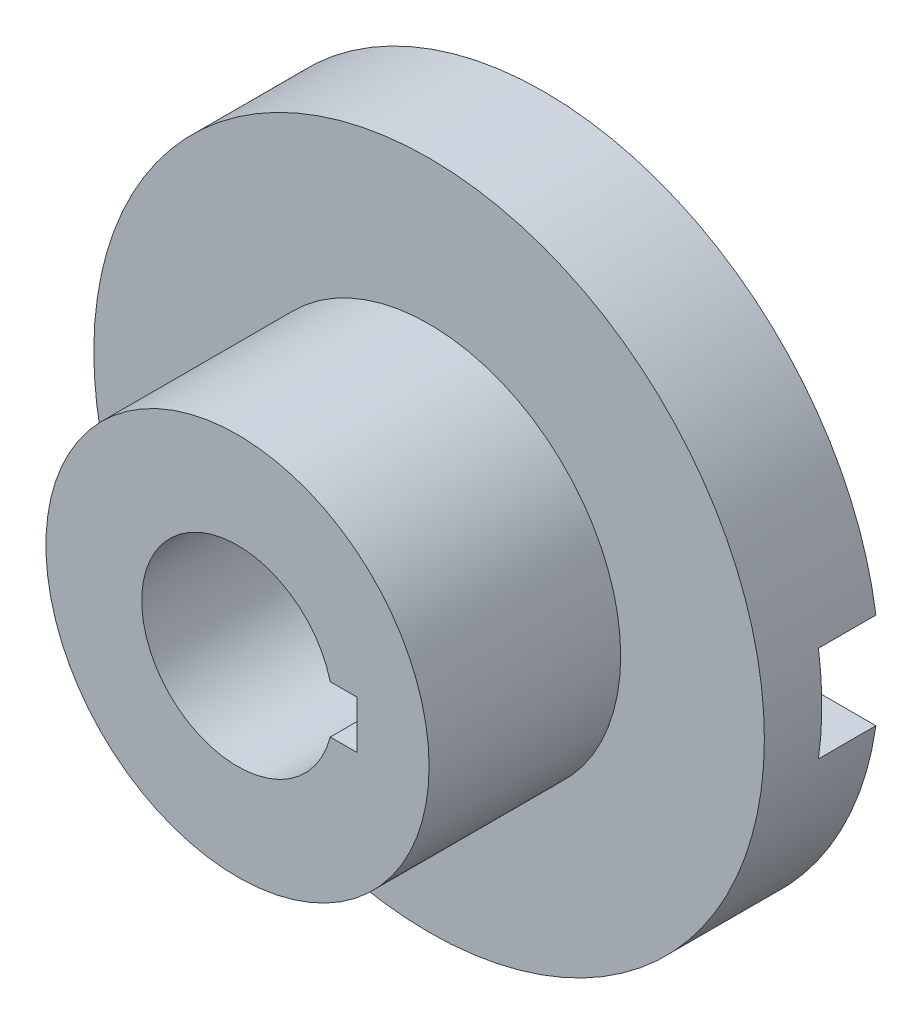
ISO-10303-21;
HEADER;
FILE_DESCRIPTION(('STEP AP214'),'2;1');
FILE_NAME('part.step','',(''),(''),'','','');
FILE_SCHEMA(('AUTOMOTIVE_DESIGN { 1 0 10303 214 1 1 1 1 }'));
ENDSEC;
DATA;
#1=APPLICATION_CONTEXT('core data for automotive mechanical design processes');
#2=APPLICATION_PROTOCOL_DEFINITION('international standard','automotive_design',2000,#1);
#3=PRODUCT_CONTEXT('',#1,'mechanical');
#4=PRODUCT('Part','Part','',(#3));
#5=PRODUCT_RELATED_PRODUCT_CATEGORY('part','',(#4));
#6=PRODUCT_DEFINITION_FORMATION('','',#4);
#7=PRODUCT_DEFINITION_CONTEXT('part definition',#1,'design');
#8=PRODUCT_DEFINITION('design','',#6,#7);
#9=PRODUCT_DEFINITION_SHAPE('','',#8);
#10=(LENGTH_UNIT() NAMED_UNIT(*) SI_UNIT(.MILLI.,.METRE.));
#11=(NAMED_UNIT(*) PLANE_ANGLE_UNIT() SI_UNIT($,.RADIAN.));
#12=(NAMED_UNIT(*) SI_UNIT($,.STERADIAN.) SOLID_ANGLE_UNIT());
#13=UNCERTAINTY_MEASURE_WITH_UNIT(LENGTH_MEASURE(1.E-05),#10,'distance_accuracy_value','');
#14=(GEOMETRIC_REPRESENTATION_CONTEXT(3) GLOBAL_UNCERTAINTY_ASSIGNED_CONTEXT((#13)) GLOBAL_UNIT_ASSIGNED_CONTEXT((#10,
#11,#12)) REPRESENTATION_CONTEXT('',''));
#15=CARTESIAN_POINT('',(0.,0.,0.));
#16=DIRECTION('',(0.,0.,1.));
#17=DIRECTION('',(1.,0.,0.));
#18=AXIS2_PLACEMENT_3D('',#15,#16,#17);
#19=CARTESIAN_POINT('',(0.,0.,-6.));
#20=DIRECTION('',(0.,0.,1.));
#21=DIRECTION('',(1.,0.,0.));
#22=AXIS2_PLACEMENT_3D('',#19,#20,#21);
#23=PLANE('',#22);
#24=DIRECTION('',(-1.,0.,0.));
#25=VECTOR('',#24,1.);
#26=CARTESIAN_POINT('',(-41.0164372620648,-5.,-6.));
#27=LINE('',#26,#25);
#28=CARTESIAN_POINT('',(34.6410161513775,-5.00000000000001,-6.));
#29=VERTEX_POINT('',#28);
#30=CARTESIAN_POINT('',(8.66025403784439,-5.,-6.));
#31=VERTEX_POINT('',#30);
#32=EDGE_CURVE('E128',#29,#31,#27,.T.);
#33=ORIENTED_EDGE('',*,*,#32,.F.);
#34=CARTESIAN_POINT('',(0.,0.,-6.));
#35=DIRECTION('',(0.,0.,1.));
#36=DIRECTION('',(1.,0.,0.));
#37=AXIS2_PLACEMENT_3D('',#34,#35,#36);
#38=CIRCLE('',#37,35.);
#39=CARTESIAN_POINT('',(-34.6410161513775,-5.,-6.));
#40=VERTEX_POINT('',#39);
#41=EDGE_CURVE('E145',#40,#29,#38,.T.);
#42=ORIENTED_EDGE('',*,*,#41,.F.);
#43=CARTESIAN_POINT('',(-8.66025403784439,-5.,-6.));
#44=VERTEX_POINT('',#43);
#45=EDGE_CURVE('E146',#44,#40,#27,.T.);
#46=ORIENTED_EDGE('',*,*,#45,.F.);
#47=CARTESIAN_POINT('',(0.,0.,-6.));
#48=DIRECTION('',(0.,0.,1.));
#49=DIRECTION('',(1.,0.,0.));
#50=AXIS2_PLACEMENT_3D('',#47,#48,#49);
#51=CIRCLE('',#50,10.);
#52=EDGE_CURVE('E148',#44,#31,#51,.T.);
#53=ORIENTED_EDGE('',*,*,#52,.T.);
#54=EDGE_LOOP('',(#33,#42,#46,#53));
#55=FACE_BOUND('',#54,.T.);
#56=ADVANCED_FACE('F39',(#55),#23,.F.);
#57=DIRECTION('',(1.,0.,0.));
#58=VECTOR('',#57,1.);
#59=CARTESIAN_POINT('',(-41.0164372620648,5.,-6.));
#60=LINE('',#59,#58);
#61=CARTESIAN_POINT('',(-34.6410161513775,5.,-6.));
#62=VERTEX_POINT('',#61);
#63=CARTESIAN_POINT('',(-8.66025403784439,5.,-6.));
#64=VERTEX_POINT('',#63);
#65=EDGE_CURVE('E201',#62,#64,#60,.T.);
#66=ORIENTED_EDGE('',*,*,#65,.F.);
#67=CARTESIAN_POINT('',(34.6410161513775,4.99999999999999,-6.));
#68=VERTEX_POINT('',#67);
#69=EDGE_CURVE('E153',#68,#62,#38,.T.);
#70=ORIENTED_EDGE('',*,*,#69,.F.);
#71=CARTESIAN_POINT('',(8.66025403784439,5.,-6.));
#72=VERTEX_POINT('',#71);
#73=EDGE_CURVE('E150',#72,#68,#60,.T.);
#74=ORIENTED_EDGE('',*,*,#73,.F.);
#75=EDGE_CURVE('E164',#72,#64,#51,.T.);
#76=ORIENTED_EDGE('',*,*,#75,.T.);
#77=EDGE_LOOP('',(#66,#70,#74,#76));
#78=FACE_BOUND('',#77,.T.);
#79=ADVANCED_FACE('F217',(#78),#23,.F.);
#80=CARTESIAN_POINT('',(12.5,2.5,-6.));
#81=DIRECTION('',(1.,0.,0.));
#82=DIRECTION('',(0.,0.,-1.));
#83=AXIS2_PLACEMENT_3D('',#80,#81,#82);
#84=PLANE('',#83);
#85=DIRECTION('',(0.,1.,0.));
#86=VECTOR('',#85,1.);
#87=CARTESIAN_POINT('',(12.5,2.5,0.));
#88=LINE('',#87,#86);
#89=CARTESIAN_POINT('',(12.5,-2.5,0.));
#90=VERTEX_POINT('',#89);
#91=CARTESIAN_POINT('',(12.5,2.5,0.));
#92=VERTEX_POINT('',#91);
#93=EDGE_CURVE('E65',#90,#92,#88,.T.);
#94=ORIENTED_EDGE('',*,*,#93,.F.);
#95=DIRECTION('',(0.,0.,1.));
#96=VECTOR('',#95,1.);
#97=CARTESIAN_POINT('',(12.5,-2.5,-6.));
#98=LINE('',#97,#96);
#99=CARTESIAN_POINT('',(12.5,-2.5,26.));
#100=VERTEX_POINT('',#99);
#101=EDGE_CURVE('E167',#90,#100,#98,.T.);
#102=ORIENTED_EDGE('',*,*,#101,.T.);
#103=DIRECTION('',(0.,1.,0.));
#104=VECTOR('',#103,1.);
#105=CARTESIAN_POINT('',(12.5,2.5,26.));
#106=LINE('',#105,#104);
#107=CARTESIAN_POINT('',(12.5,2.5,26.));
#108=VERTEX_POINT('',#107);
#109=EDGE_CURVE('E281',#100,#108,#106,.T.);
#110=ORIENTED_EDGE('',*,*,#109,.T.);
#111=DIRECTION('',(0.,0.,1.));
#112=VECTOR('',#111,1.);
#113=CARTESIAN_POINT('',(12.5,2.5,-6.));
#114=LINE('',#113,#112);
#115=EDGE_CURVE('E225',#92,#108,#114,.T.);
#116=ORIENTED_EDGE('',*,*,#115,.F.);
#117=EDGE_LOOP('',(#94,#102,#110,#116));
#118=FACE_BOUND('',#117,.T.);
#119=ADVANCED_FACE('F246',(#118),#84,.F.);
#120=CARTESIAN_POINT('',(7.5,-2.5,-6.));
#121=DIRECTION('',(0.,-1.,0.));
#122=DIRECTION('',(0.,0.,-1.));
#123=AXIS2_PLACEMENT_3D('',#120,#121,#122);
#124=PLANE('',#123);
#125=DIRECTION('',(1.,0.,0.));
#126=VECTOR('',#125,1.);
#127=CARTESIAN_POINT('',(7.5,-2.5,0.));
#128=LINE('',#127,#126);
#129=CARTESIAN_POINT('',(9.68245836551854,-2.5,0.));
#130=VERTEX_POINT('',#129);
#131=EDGE_CURVE('E194',#130,#90,#128,.T.);
#132=ORIENTED_EDGE('',*,*,#131,.F.);
#133=DIRECTION('',(0.,0.,-1.));
#134=VECTOR('',#133,1.);
#135=CARTESIAN_POINT('',(9.68245836551854,-2.5,26.));
#136=LINE('',#135,#134);
#137=CARTESIAN_POINT('',(9.68245836551854,-2.5,26.));
#138=VERTEX_POINT('',#137);
#139=EDGE_CURVE('E168',#130,#138,#136,.F.);
#140=ORIENTED_EDGE('',*,*,#139,.T.);
#141=DIRECTION('',(1.,0.,0.));
#142=VECTOR('',#141,1.);
#143=CARTESIAN_POINT('',(7.5,-2.5,26.));
#144=LINE('',#143,#142);
#145=EDGE_CURVE('E295',#138,#100,#144,.T.);
#146=ORIENTED_EDGE('',*,*,#145,.T.);
#147=ORIENTED_EDGE('',*,*,#101,.F.);
#148=EDGE_LOOP('',(#132,#140,#146,#147));
#149=FACE_BOUND('',#148,.T.);
#150=ADVANCED_FACE('F242',(#149),#124,.F.);
#151=CARTESIAN_POINT('',(7.5,2.5,-6.));
#152=DIRECTION('',(0.,1.,0.));
#153=DIRECTION('',(0.,0.,1.));
#154=AXIS2_PLACEMENT_3D('',#151,#152,#153);
#155=PLANE('',#154);
#156=DIRECTION('',(-1.,0.,0.));
#157=VECTOR('',#156,1.);
#158=CARTESIAN_POINT('',(7.5,2.5,0.));
#159=LINE('',#158,#157);
#160=CARTESIAN_POINT('',(9.68245836551854,2.5,0.));
#161=VERTEX_POINT('',#160);
#162=EDGE_CURVE('E174',#92,#161,#159,.T.);
#163=ORIENTED_EDGE('',*,*,#162,.F.);
#164=ORIENTED_EDGE('',*,*,#115,.T.);
#165=DIRECTION('',(-1.,0.,0.));
#166=VECTOR('',#165,1.);
#167=CARTESIAN_POINT('',(7.5,2.5,26.));
#168=LINE('',#167,#166);
#169=CARTESIAN_POINT('',(9.68245836551854,2.5,26.));
#170=VERTEX_POINT('',#169);
#171=EDGE_CURVE('E288',#108,#170,#168,.T.);
#172=ORIENTED_EDGE('',*,*,#171,.T.);
#173=DIRECTION('',(0.,0.,-1.));
#174=VECTOR('',#173,1.);
#175=CARTESIAN_POINT('',(9.68245836551854,2.5,26.));
#176=LINE('',#175,#174);
#177=EDGE_CURVE('E170',#170,#161,#176,.T.);
#178=ORIENTED_EDGE('',*,*,#177,.T.);
#179=EDGE_LOOP('',(#163,#164,#172,#178));
#180=FACE_BOUND('',#179,.T.);
#181=ADVANCED_FACE('F234',(#180),#155,.F.);
#182=CARTESIAN_POINT('',(0.,0.,6.));
#183=DIRECTION('',(0.,0.,-1.));
#184=DIRECTION('',(-1.,0.,0.));
#185=AXIS2_PLACEMENT_3D('',#182,#183,#184);
#186=CYLINDRICAL_SURFACE('',#185,35.);
#187=CARTESIAN_POINT('',(0.,0.,0.));
#188=DIRECTION('',(0.,0.,-1.));
#189=DIRECTION('',(-1.,0.,0.));
#190=AXIS2_PLACEMENT_3D('',#187,#188,#189);
#191=CIRCLE('',#190,35.);
#192=CARTESIAN_POINT('',(34.6410161513775,4.99999999999999,0.));
#193=VERTEX_POINT('',#192);
#194=CARTESIAN_POINT('',(34.6410161513775,-5.,0.));
#195=VERTEX_POINT('',#194);
#196=EDGE_CURVE('E140',#193,#195,#191,.T.);
#197=ORIENTED_EDGE('',*,*,#196,.F.);
#198=DIRECTION('',(0.,0.,-1.));
#199=VECTOR('',#198,1.);
#200=CARTESIAN_POINT('',(34.6410161513776,4.99999999999999,6.));
#201=LINE('',#200,#199);
#202=EDGE_CURVE('E285',#193,#68,#201,.T.);
#203=ORIENTED_EDGE('',*,*,#202,.T.);
#204=ORIENTED_EDGE('',*,*,#69,.T.);
#205=DIRECTION('',(0.,0.,-1.));
#206=VECTOR('',#205,1.);
#207=CARTESIAN_POINT('',(-34.6410161513776,5.,6.));
#208=LINE('',#207,#206);
#209=CARTESIAN_POINT('',(-34.6410161513775,5.,0.));
#210=VERTEX_POINT('',#209);
#211=EDGE_CURVE('E211',#62,#210,#208,.F.);
#212=ORIENTED_EDGE('',*,*,#211,.T.);
#213=CARTESIAN_POINT('',(-34.6410161513775,-5.,0.));
#214=VERTEX_POINT('',#213);
#215=EDGE_CURVE('E198',#214,#210,#191,.T.);
#216=ORIENTED_EDGE('',*,*,#215,.F.);
#217=DIRECTION('',(0.,0.,-1.));
#218=VECTOR('',#217,1.);
#219=CARTESIAN_POINT('',(-34.6410161513776,-5.,6.));
#220=LINE('',#219,#218);
#221=EDGE_CURVE('E139',#214,#40,#220,.T.);
#222=ORIENTED_EDGE('',*,*,#221,.T.);
#223=ORIENTED_EDGE('',*,*,#41,.T.);
#224=DIRECTION('',(0.,0.,-1.));
#225=VECTOR('',#224,1.);
#226=CARTESIAN_POINT('',(34.6410161513776,-5.00000000000001,6.));
#227=LINE('',#226,#225);
#228=EDGE_CURVE('E130',#29,#195,#227,.F.);
#229=ORIENTED_EDGE('',*,*,#228,.T.);
#230=EDGE_LOOP('',(#197,#203,#204,#212,#216,#222,#223,#229));
#231=FACE_BOUND('',#230,.T.);
#232=CARTESIAN_POINT('',(0.,0.,6.));
#233=DIRECTION('',(0.,0.,1.));
#234=DIRECTION('',(1.,0.,0.));
#235=AXIS2_PLACEMENT_3D('',#232,#233,#234);
#236=CIRCLE('',#235,35.);
#237=CARTESIAN_POINT('',(35.,0.,6.));
#238=VERTEX_POINT('',#237);
#239=EDGE_CURVE('E160',#238,#238,#236,.T.);
#240=ORIENTED_EDGE('',*,*,#239,.F.);
#241=EDGE_LOOP('',(#240));
#242=FACE_BOUND('',#241,.T.);
#243=ADVANCED_FACE('F41',(#231,#242),#186,.T.);
#244=CARTESIAN_POINT('',(0.,0.,6.));
#245=DIRECTION('',(0.,0.,1.));
#246=DIRECTION('',(1.,0.,0.));
#247=AXIS2_PLACEMENT_3D('',#244,#245,#246);
#248=PLANE('',#247);
#249=CARTESIAN_POINT('',(0.,0.,6.));
#250=DIRECTION('',(0.,0.,1.));
#251=DIRECTION('',(1.,0.,0.));
#252=AXIS2_PLACEMENT_3D('',#249,#250,#251);
#253=CIRCLE('',#252,20.);
#254=CARTESIAN_POINT('',(20.,0.,6.));
#255=VERTEX_POINT('',#254);
#256=EDGE_CURVE('E172',#255,#255,#253,.T.);
#257=ORIENTED_EDGE('',*,*,#256,.F.);
#258=EDGE_LOOP('',(#257));
#259=FACE_BOUND('',#258,.T.);
#260=ORIENTED_EDGE('',*,*,#239,.T.);
#261=EDGE_LOOP('',(#260));
#262=FACE_BOUND('',#261,.T.);
#263=ADVANCED_FACE('F228',(#259,#262),#248,.T.);
#264=CARTESIAN_POINT('',(0.,0.,26.));
#265=DIRECTION('',(0.,0.,1.));
#266=DIRECTION('',(1.,0.,0.));
#267=AXIS2_PLACEMENT_3D('',#264,#265,#266);
#268=PLANE('',#267);
#269=ORIENTED_EDGE('',*,*,#171,.F.);
#270=ORIENTED_EDGE('',*,*,#109,.F.);
#271=ORIENTED_EDGE('',*,*,#145,.F.);
#272=CARTESIAN_POINT('',(0.,0.,26.));
#273=DIRECTION('',(0.,0.,1.));
#274=DIRECTION('',(1.,0.,0.));
#275=AXIS2_PLACEMENT_3D('',#272,#273,#274);
#276=CIRCLE('',#275,10.);
#277=EDGE_CURVE('E157',#170,#138,#276,.T.);
#278=ORIENTED_EDGE('',*,*,#277,.F.);
#279=EDGE_LOOP('',(#269,#270,#271,#278));
#280=FACE_BOUND('',#279,.T.);
#281=CARTESIAN_POINT('',(0.,0.,26.));
#282=DIRECTION('',(0.,0.,1.));
#283=DIRECTION('',(1.,0.,0.));
#284=AXIS2_PLACEMENT_3D('',#281,#282,#283);
#285=CIRCLE('',#284,20.);
#286=CARTESIAN_POINT('',(20.,0.,26.));
#287=VERTEX_POINT('',#286);
#288=EDGE_CURVE('E152',#287,#287,#285,.T.);
#289=ORIENTED_EDGE('',*,*,#288,.T.);
#290=EDGE_LOOP('',(#289));
#291=FACE_BOUND('',#290,.T.);
#292=ADVANCED_FACE('F236',(#280,#291),#268,.T.);
#293=CARTESIAN_POINT('',(0.,0.,26.));
#294=DIRECTION('',(0.,0.,-1.));
#295=DIRECTION('',(-1.,0.,0.));
#296=AXIS2_PLACEMENT_3D('',#293,#294,#295);
#297=CYLINDRICAL_SURFACE('',#296,20.);
#298=ORIENTED_EDGE('',*,*,#288,.F.);
#299=EDGE_LOOP('',(#298));
#300=FACE_BOUND('',#299,.T.);
#301=ORIENTED_EDGE('',*,*,#256,.T.);
#302=EDGE_LOOP('',(#301));
#303=FACE_BOUND('',#302,.T.);
#304=ADVANCED_FACE('F253',(#300,#303),#297,.T.);
#305=CARTESIAN_POINT('',(0.,0.,26.));
#306=DIRECTION('',(0.,0.,-1.));
#307=DIRECTION('',(-1.,0.,0.));
#308=AXIS2_PLACEMENT_3D('',#305,#306,#307);
#309=CYLINDRICAL_SURFACE('',#308,10.);
#310=DIRECTION('',(0.,0.,-1.));
#311=VECTOR('',#310,1.);
#312=CARTESIAN_POINT('',(8.66025403784439,5.,26.));
#313=LINE('',#312,#311);
#314=CARTESIAN_POINT('',(8.66025403784439,5.,0.));
#315=VERTEX_POINT('',#314);
#316=EDGE_CURVE('E11',#315,#72,#313,.T.);
#317=ORIENTED_EDGE('',*,*,#316,.F.);
#318=CARTESIAN_POINT('',(0.,0.,0.));
#319=DIRECTION('',(0.,0.,-1.));
#320=DIRECTION('',(-1.,0.,0.));
#321=AXIS2_PLACEMENT_3D('',#318,#319,#320);
#322=CIRCLE('',#321,10.);
#323=EDGE_CURVE('E191',#315,#161,#322,.T.);
#324=ORIENTED_EDGE('',*,*,#323,.T.);
#325=ORIENTED_EDGE('',*,*,#177,.F.);
#326=ORIENTED_EDGE('',*,*,#277,.T.);
#327=ORIENTED_EDGE('',*,*,#139,.F.);
#328=CARTESIAN_POINT('',(8.66025403784439,-5.,0.));
#329=VERTEX_POINT('',#328);
#330=EDGE_CURVE('E182',#130,#329,#322,.T.);
#331=ORIENTED_EDGE('',*,*,#330,.T.);
#332=DIRECTION('',(0.,0.,-1.));
#333=VECTOR('',#332,1.);
#334=CARTESIAN_POINT('',(8.66025403784439,-5.,26.));
#335=LINE('',#334,#333);
#336=EDGE_CURVE('E50',#31,#329,#335,.F.);
#337=ORIENTED_EDGE('',*,*,#336,.F.);
#338=ORIENTED_EDGE('',*,*,#52,.F.);
#339=DIRECTION('',(0.,0.,-1.));
#340=VECTOR('',#339,1.);
#341=CARTESIAN_POINT('',(-8.66025403784439,-5.,26.));
#342=LINE('',#341,#340);
#343=CARTESIAN_POINT('',(-8.66025403784439,-5.,0.));
#344=VERTEX_POINT('',#343);
#345=EDGE_CURVE('E173',#344,#44,#342,.T.);
#346=ORIENTED_EDGE('',*,*,#345,.F.);
#347=CARTESIAN_POINT('',(-8.66025403784439,5.,0.));
#348=VERTEX_POINT('',#347);
#349=EDGE_CURVE('E192',#344,#348,#322,.T.);
#350=ORIENTED_EDGE('',*,*,#349,.T.);
#351=DIRECTION('',(0.,0.,-1.));
#352=VECTOR('',#351,1.);
#353=CARTESIAN_POINT('',(-8.66025403784439,5.,26.));
#354=LINE('',#353,#352);
#355=EDGE_CURVE('E179',#64,#348,#354,.F.);
#356=ORIENTED_EDGE('',*,*,#355,.F.);
#357=ORIENTED_EDGE('',*,*,#75,.F.);
#358=EDGE_LOOP('',(#317,#324,#325,#326,#327,#331,#337,#338,#346,#350,#356,#357));
#359=FACE_BOUND('',#358,.T.);
#360=ADVANCED_FACE('F186',(#359),#309,.F.);
#361=CARTESIAN_POINT('',(0.,0.,0.));
#362=DIRECTION('',(0.,0.,-1.));
#363=DIRECTION('',(-1.,0.,0.));
#364=AXIS2_PLACEMENT_3D('',#361,#362,#363);
#365=PLANE('',#364);
#366=ORIENTED_EDGE('',*,*,#196,.T.);
#367=DIRECTION('',(-1.,0.,0.));
#368=VECTOR('',#367,1.);
#369=CARTESIAN_POINT('',(-41.0164372620648,-5.,0.));
#370=LINE('',#369,#368);
#371=EDGE_CURVE('E134',#195,#329,#370,.T.);
#372=ORIENTED_EDGE('',*,*,#371,.T.);
#373=ORIENTED_EDGE('',*,*,#330,.F.);
#374=ORIENTED_EDGE('',*,*,#131,.T.);
#375=ORIENTED_EDGE('',*,*,#93,.T.);
#376=ORIENTED_EDGE('',*,*,#162,.T.);
#377=ORIENTED_EDGE('',*,*,#323,.F.);
#378=DIRECTION('',(1.,0.,0.));
#379=VECTOR('',#378,1.);
#380=CARTESIAN_POINT('',(-41.0164372620648,5.,0.));
#381=LINE('',#380,#379);
#382=EDGE_CURVE('E184',#315,#193,#381,.T.);
#383=ORIENTED_EDGE('',*,*,#382,.T.);
#384=EDGE_LOOP('',(#366,#372,#373,#374,#375,#376,#377,#383));
#385=FACE_BOUND('',#384,.T.);
#386=ADVANCED_FACE('F178',(#385),#365,.T.);
#387=CARTESIAN_POINT('',(-41.0164372620648,-5.,0.));
#388=DIRECTION('',(0.,-1.,0.));
#389=DIRECTION('',(1.,0.,0.));
#390=AXIS2_PLACEMENT_3D('',#387,#388,#389);
#391=PLANE('',#390);
#392=ORIENTED_EDGE('',*,*,#32,.T.);
#393=ORIENTED_EDGE('',*,*,#336,.T.);
#394=ORIENTED_EDGE('',*,*,#371,.F.);
#395=ORIENTED_EDGE('',*,*,#228,.F.);
#396=EDGE_LOOP('',(#392,#393,#394,#395));
#397=FACE_BOUND('',#396,.T.);
#398=ADVANCED_FACE('F129',(#397),#391,.F.);
#399=CARTESIAN_POINT('',(-41.0164372620648,5.,0.));
#400=DIRECTION('',(0.,1.,0.));
#401=DIRECTION('',(-1.,0.,0.));
#402=AXIS2_PLACEMENT_3D('',#399,#400,#401);
#403=PLANE('',#402);
#404=ORIENTED_EDGE('',*,*,#382,.F.);
#405=ORIENTED_EDGE('',*,*,#316,.T.);
#406=ORIENTED_EDGE('',*,*,#73,.T.);
#407=ORIENTED_EDGE('',*,*,#202,.F.);
#408=EDGE_LOOP('',(#404,#405,#406,#407));
#409=FACE_BOUND('',#408,.T.);
#410=ADVANCED_FACE('F267',(#409),#403,.F.);
#411=ORIENTED_EDGE('',*,*,#65,.T.);
#412=ORIENTED_EDGE('',*,*,#355,.T.);
#413=EDGE_CURVE('E53',#210,#348,#381,.T.);
#414=ORIENTED_EDGE('',*,*,#413,.F.);
#415=ORIENTED_EDGE('',*,*,#211,.F.);
#416=EDGE_LOOP('',(#411,#412,#414,#415));
#417=FACE_BOUND('',#416,.T.);
#418=ADVANCED_FACE('F207',(#417),#403,.F.);
#419=EDGE_CURVE('E183',#344,#214,#370,.T.);
#420=ORIENTED_EDGE('',*,*,#419,.F.);
#421=ORIENTED_EDGE('',*,*,#345,.T.);
#422=ORIENTED_EDGE('',*,*,#45,.T.);
#423=ORIENTED_EDGE('',*,*,#221,.F.);
#424=EDGE_LOOP('',(#420,#421,#422,#423));
#425=FACE_BOUND('',#424,.T.);
#426=ADVANCED_FACE('F262',(#425),#391,.F.);
#427=ORIENTED_EDGE('',*,*,#215,.T.);
#428=ORIENTED_EDGE('',*,*,#413,.T.);
#429=ORIENTED_EDGE('',*,*,#349,.F.);
#430=ORIENTED_EDGE('',*,*,#419,.T.);
#431=EDGE_LOOP('',(#427,#428,#429,#430));
#432=FACE_BOUND('',#431,.T.);
#433=ADVANCED_FACE('F270',(#432),#365,.T.);
#434=CLOSED_SHELL('',(#56,#79,#119,#150,#181,#243,#263,#292,#304,#360,#386,#398,#410,#418,#426,#433));
#435=MANIFOLD_SOLID_BREP('B2',#434);
#436=ADVANCED_BREP_SHAPE_REPRESENTATION('',(#18,#435),#14);
#437=SHAPE_DEFINITION_REPRESENTATION(#9,#436);
ENDSEC;
END-ISO-10303-21;
